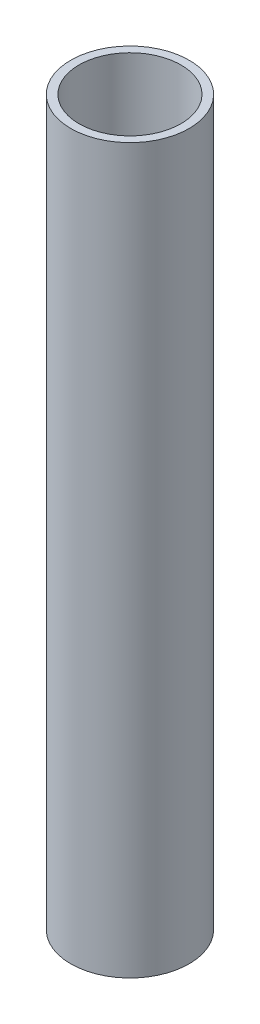
ISO-10303-21;
HEADER;
FILE_DESCRIPTION(('STEP AP214'),'2;1');
FILE_NAME('part.step','',(''),(''),'','','');
FILE_SCHEMA(('AUTOMOTIVE_DESIGN { 1 0 10303 214 1 1 1 1 }'));
ENDSEC;
DATA;
#1=APPLICATION_CONTEXT('core data for automotive mechanical design processes');
#2=APPLICATION_PROTOCOL_DEFINITION('international standard','automotive_design',2000,#1);
#3=PRODUCT_CONTEXT('',#1,'mechanical');
#4=PRODUCT('Part','Part','',(#3));
#5=PRODUCT_RELATED_PRODUCT_CATEGORY('part','',(#4));
#6=PRODUCT_DEFINITION_FORMATION('','',#4);
#7=PRODUCT_DEFINITION_CONTEXT('part definition',#1,'design');
#8=PRODUCT_DEFINITION('design','',#6,#7);
#9=PRODUCT_DEFINITION_SHAPE('','',#8);
#10=(LENGTH_UNIT() NAMED_UNIT(*) SI_UNIT(.MILLI.,.METRE.));
#11=(NAMED_UNIT(*) PLANE_ANGLE_UNIT() SI_UNIT($,.RADIAN.));
#12=(NAMED_UNIT(*) SI_UNIT($,.STERADIAN.) SOLID_ANGLE_UNIT());
#13=UNCERTAINTY_MEASURE_WITH_UNIT(LENGTH_MEASURE(1.E-05),#10,'distance_accuracy_value','');
#14=(GEOMETRIC_REPRESENTATION_CONTEXT(3) GLOBAL_UNCERTAINTY_ASSIGNED_CONTEXT((#13)) GLOBAL_UNIT_ASSIGNED_CONTEXT((#10,
#11,#12)) REPRESENTATION_CONTEXT('',''));
#15=CARTESIAN_POINT('',(0.,0.,0.));
#16=DIRECTION('',(0.,0.,1.));
#17=DIRECTION('',(1.,0.,0.));
#18=AXIS2_PLACEMENT_3D('',#15,#16,#17);
#19=CARTESIAN_POINT('',(0.,110.,0.));
#20=DIRECTION('',(0.,1.,0.));
#21=DIRECTION('',(0.,0.,1.));
#22=AXIS2_PLACEMENT_3D('',#19,#20,#21);
#23=PLANE('',#22);
#24=CARTESIAN_POINT('',(0.,110.,0.));
#25=DIRECTION('',(0.,1.,0.));
#26=DIRECTION('',(0.,0.,1.));
#27=AXIS2_PLACEMENT_3D('',#24,#25,#26);
#28=CIRCLE('',#27,9.);
#29=CARTESIAN_POINT('',(0.,110.,9.));
#30=VERTEX_POINT('',#29);
#31=EDGE_CURVE('E10',#30,#30,#28,.T.);
#32=ORIENTED_EDGE('',*,*,#31,.T.);
#33=EDGE_LOOP('',(#32));
#34=FACE_BOUND('',#33,.T.);
#35=CARTESIAN_POINT('',(0.,110.,0.));
#36=DIRECTION('',(0.,1.,0.));
#37=DIRECTION('',(0.,0.,1.));
#38=AXIS2_PLACEMENT_3D('',#35,#36,#37);
#39=CIRCLE('',#38,7.75);
#40=CARTESIAN_POINT('',(0.,110.,7.75));
#41=VERTEX_POINT('',#40);
#42=EDGE_CURVE('E42',#41,#41,#39,.T.);
#43=ORIENTED_EDGE('',*,*,#42,.F.);
#44=EDGE_LOOP('',(#43));
#45=FACE_BOUND('',#44,.T.);
#46=ADVANCED_FACE('F31',(#34,#45),#23,.T.);
#47=CARTESIAN_POINT('',(0.,0.,0.));
#48=DIRECTION('',(0.,1.,0.));
#49=DIRECTION('',(0.,0.,1.));
#50=AXIS2_PLACEMENT_3D('',#47,#48,#49);
#51=PLANE('',#50);
#52=CARTESIAN_POINT('',(0.,0.,0.));
#53=DIRECTION('',(0.,1.,0.));
#54=DIRECTION('',(0.,0.,1.));
#55=AXIS2_PLACEMENT_3D('',#52,#53,#54);
#56=CIRCLE('',#55,9.);
#57=CARTESIAN_POINT('',(0.,0.,9.));
#58=VERTEX_POINT('',#57);
#59=EDGE_CURVE('E35',#58,#58,#56,.T.);
#60=ORIENTED_EDGE('',*,*,#59,.F.);
#61=EDGE_LOOP('',(#60));
#62=FACE_BOUND('',#61,.T.);
#63=CARTESIAN_POINT('',(0.,0.,0.));
#64=DIRECTION('',(0.,1.,0.));
#65=DIRECTION('',(0.,0.,1.));
#66=AXIS2_PLACEMENT_3D('',#63,#64,#65);
#67=CIRCLE('',#66,7.75);
#68=CARTESIAN_POINT('',(0.,0.,7.75));
#69=VERTEX_POINT('',#68);
#70=EDGE_CURVE('E44',#69,#69,#67,.T.);
#71=ORIENTED_EDGE('',*,*,#70,.T.);
#72=EDGE_LOOP('',(#71));
#73=FACE_BOUND('',#72,.T.);
#74=ADVANCED_FACE('F54',(#62,#73),#51,.F.);
#75=CARTESIAN_POINT('',(0.,110.,0.));
#76=DIRECTION('',(0.,-1.,0.));
#77=DIRECTION('',(0.,0.,-1.));
#78=AXIS2_PLACEMENT_3D('',#75,#76,#77);
#79=CYLINDRICAL_SURFACE('',#78,9.);
#80=ORIENTED_EDGE('',*,*,#31,.F.);
#81=EDGE_LOOP('',(#80));
#82=FACE_BOUND('',#81,.T.);
#83=ORIENTED_EDGE('',*,*,#59,.T.);
#84=EDGE_LOOP('',(#83));
#85=FACE_BOUND('',#84,.T.);
#86=ADVANCED_FACE('F33',(#82,#85),#79,.T.);
#87=CARTESIAN_POINT('',(0.,110.,0.));
#88=DIRECTION('',(0.,-1.,0.));
#89=DIRECTION('',(0.,0.,-1.));
#90=AXIS2_PLACEMENT_3D('',#87,#88,#89);
#91=CYLINDRICAL_SURFACE('',#90,7.75);
#92=ORIENTED_EDGE('',*,*,#42,.T.);
#93=EDGE_LOOP('',(#92));
#94=FACE_BOUND('',#93,.T.);
#95=ORIENTED_EDGE('',*,*,#70,.F.);
#96=EDGE_LOOP('',(#95));
#97=FACE_BOUND('',#96,.T.);
#98=ADVANCED_FACE('F50',(#94,#97),#91,.F.);
#99=CLOSED_SHELL('',(#46,#74,#86,#98));
#100=MANIFOLD_SOLID_BREP('B2',#99);
#101=ADVANCED_BREP_SHAPE_REPRESENTATION('',(#18,#100),#14);
#102=SHAPE_DEFINITION_REPRESENTATION(#9,#101);
ENDSEC;
END-ISO-10303-21;
